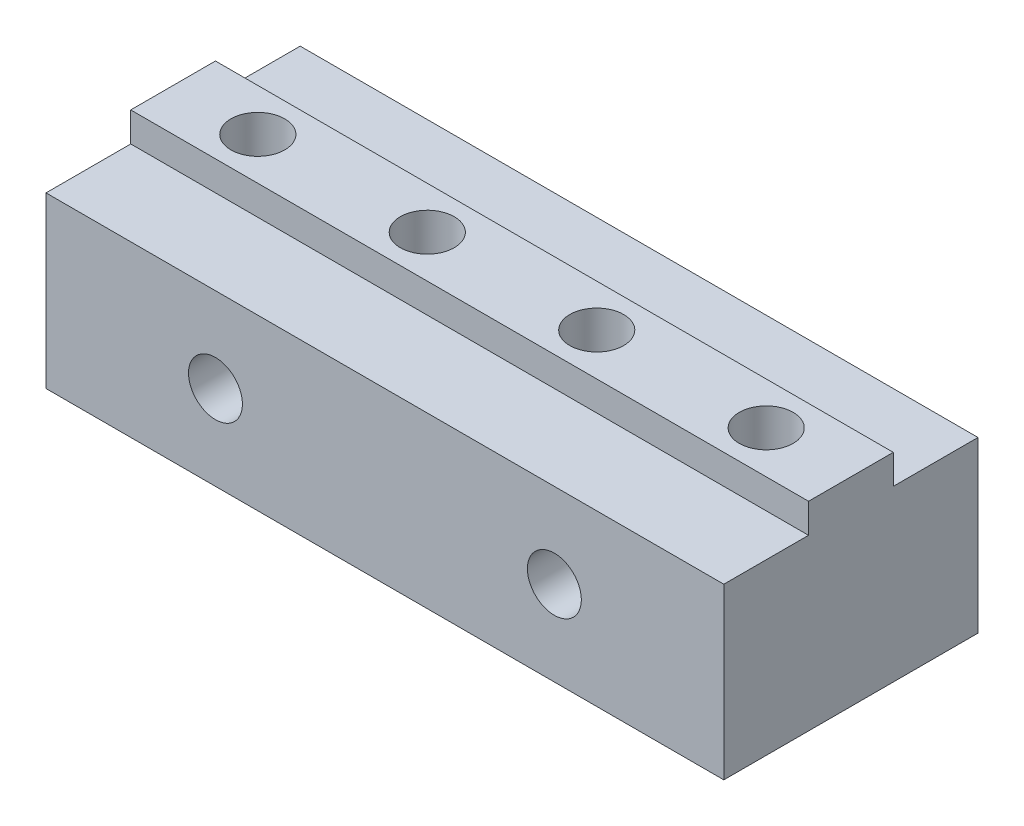
ISO-10303-21;
HEADER;
FILE_DESCRIPTION(('STEP AP214'),'2;1');
FILE_NAME('part.step','',(''),(''),'','','');
FILE_SCHEMA(('AUTOMOTIVE_DESIGN { 1 0 10303 214 1 1 1 1 }'));
ENDSEC;
DATA;
#1=APPLICATION_CONTEXT('core data for automotive mechanical design processes');
#2=APPLICATION_PROTOCOL_DEFINITION('international standard','automotive_design',2000,#1);
#3=PRODUCT_CONTEXT('',#1,'mechanical');
#4=PRODUCT('Part','Part','',(#3));
#5=PRODUCT_RELATED_PRODUCT_CATEGORY('part','',(#4));
#6=PRODUCT_DEFINITION_FORMATION('','',#4);
#7=PRODUCT_DEFINITION_CONTEXT('part definition',#1,'design');
#8=PRODUCT_DEFINITION('design','',#6,#7);
#9=PRODUCT_DEFINITION_SHAPE('','',#8);
#10=(LENGTH_UNIT() NAMED_UNIT(*) SI_UNIT(.MILLI.,.METRE.));
#11=(NAMED_UNIT(*) PLANE_ANGLE_UNIT() SI_UNIT($,.RADIAN.));
#12=(NAMED_UNIT(*) SI_UNIT($,.STERADIAN.) SOLID_ANGLE_UNIT());
#13=UNCERTAINTY_MEASURE_WITH_UNIT(LENGTH_MEASURE(1.E-05),#10,'distance_accuracy_value','');
#14=(GEOMETRIC_REPRESENTATION_CONTEXT(3) GLOBAL_UNCERTAINTY_ASSIGNED_CONTEXT((#13)) GLOBAL_UNIT_ASSIGNED_CONTEXT((#10,
#11,#12)) REPRESENTATION_CONTEXT('',''));
#15=CARTESIAN_POINT('',(0.,0.,0.));
#16=DIRECTION('',(0.,0.,1.));
#17=DIRECTION('',(1.,0.,0.));
#18=AXIS2_PLACEMENT_3D('',#15,#16,#17);
#19=CARTESIAN_POINT('',(0.,14.9098,0.));
#20=DIRECTION('',(0.,1.,0.));
#21=DIRECTION('',(0.,0.,1.));
#22=AXIS2_PLACEMENT_3D('',#19,#20,#21);
#23=PLANE('',#22);
#24=CARTESIAN_POINT('',(-19.05,14.9098,0.));
#25=DIRECTION('',(0.,-1.,0.));
#26=DIRECTION('',(0.,0.,-1.));
#27=AXIS2_PLACEMENT_3D('',#24,#25,#26);
#28=CIRCLE('',#27,2.0193);
#29=CARTESIAN_POINT('',(-19.05,14.9098,-2.0193));
#30=VERTEX_POINT('',#29);
#31=EDGE_CURVE('E246',#30,#30,#28,.T.);
#32=ORIENTED_EDGE('',*,*,#31,.T.);
#33=EDGE_LOOP('',(#32));
#34=FACE_BOUND('',#33,.T.);
#35=DIRECTION('',(0.,0.,1.));
#36=VECTOR('',#35,1.);
#37=CARTESIAN_POINT('',(-25.4,14.9098,3.175));
#38=LINE('',#37,#36);
#39=CARTESIAN_POINT('',(-25.4,14.9098,-3.175));
#40=VERTEX_POINT('',#39);
#41=CARTESIAN_POINT('',(-25.4,14.9098,3.175));
#42=VERTEX_POINT('',#41);
#43=EDGE_CURVE('E116',#40,#42,#38,.T.);
#44=ORIENTED_EDGE('',*,*,#43,.T.);
#45=DIRECTION('',(1.,0.,0.));
#46=VECTOR('',#45,1.);
#47=CARTESIAN_POINT('',(25.4,14.9098,3.175));
#48=LINE('',#47,#46);
#49=CARTESIAN_POINT('',(25.4,14.9098,3.175));
#50=VERTEX_POINT('',#49);
#51=EDGE_CURVE('E105',#42,#50,#48,.T.);
#52=ORIENTED_EDGE('',*,*,#51,.T.);
#53=DIRECTION('',(0.,0.,-1.));
#54=VECTOR('',#53,1.);
#55=CARTESIAN_POINT('',(25.4,14.9098,3.175));
#56=LINE('',#55,#54);
#57=CARTESIAN_POINT('',(25.4,14.9098,-3.175));
#58=VERTEX_POINT('',#57);
#59=EDGE_CURVE('E115',#50,#58,#56,.T.);
#60=ORIENTED_EDGE('',*,*,#59,.T.);
#61=DIRECTION('',(-1.,0.,0.));
#62=VECTOR('',#61,1.);
#63=CARTESIAN_POINT('',(25.4,14.9098,-3.175));
#64=LINE('',#63,#62);
#65=EDGE_CURVE('E121',#58,#40,#64,.T.);
#66=ORIENTED_EDGE('',*,*,#65,.T.);
#67=EDGE_LOOP('',(#44,#52,#60,#66));
#68=FACE_BOUND('',#67,.T.);
#69=CARTESIAN_POINT('',(19.05,14.9098,0.));
#70=DIRECTION('',(0.,-1.,0.));
#71=DIRECTION('',(0.,0.,-1.));
#72=AXIS2_PLACEMENT_3D('',#69,#70,#71);
#73=CIRCLE('',#72,2.0193);
#74=CARTESIAN_POINT('',(19.05,14.9098,-2.0193));
#75=VERTEX_POINT('',#74);
#76=EDGE_CURVE('E222',#75,#75,#73,.T.);
#77=ORIENTED_EDGE('',*,*,#76,.T.);
#78=EDGE_LOOP('',(#77));
#79=FACE_BOUND('',#78,.T.);
#80=CARTESIAN_POINT('',(6.35,14.9098,0.));
#81=DIRECTION('',(0.,-1.,0.));
#82=DIRECTION('',(0.,0.,-1.));
#83=AXIS2_PLACEMENT_3D('',#80,#81,#82);
#84=CIRCLE('',#83,2.0193);
#85=CARTESIAN_POINT('',(6.35,14.9098,-2.0193));
#86=VERTEX_POINT('',#85);
#87=EDGE_CURVE('E230',#86,#86,#84,.T.);
#88=ORIENTED_EDGE('',*,*,#87,.T.);
#89=EDGE_LOOP('',(#88));
#90=FACE_BOUND('',#89,.T.);
#91=CARTESIAN_POINT('',(-6.35,14.9098,0.));
#92=DIRECTION('',(0.,-1.,0.));
#93=DIRECTION('',(0.,0.,-1.));
#94=AXIS2_PLACEMENT_3D('',#91,#92,#93);
#95=CIRCLE('',#94,2.0193);
#96=CARTESIAN_POINT('',(-6.35,14.9098,-2.0193));
#97=VERTEX_POINT('',#96);
#98=EDGE_CURVE('E238',#97,#97,#95,.T.);
#99=ORIENTED_EDGE('',*,*,#98,.T.);
#100=EDGE_LOOP('',(#99));
#101=FACE_BOUND('',#100,.T.);
#102=ADVANCED_FACE('F39',(#34,#68,#79,#90,#101),#23,.T.);
#103=CARTESIAN_POINT('',(0.,12.7,0.));
#104=DIRECTION('',(0.,1.,0.));
#105=DIRECTION('',(0.,0.,1.));
#106=AXIS2_PLACEMENT_3D('',#103,#104,#105);
#107=PLANE('',#106);
#108=DIRECTION('',(-1.,0.,0.));
#109=VECTOR('',#108,1.);
#110=CARTESIAN_POINT('',(25.4,12.7,-3.175));
#111=LINE('',#110,#109);
#112=CARTESIAN_POINT('',(25.4,12.7,-3.175));
#113=VERTEX_POINT('',#112);
#114=CARTESIAN_POINT('',(-25.4,12.7,-3.175));
#115=VERTEX_POINT('',#114);
#116=EDGE_CURVE('E55',#113,#115,#111,.T.);
#117=ORIENTED_EDGE('',*,*,#116,.F.);
#118=DIRECTION('',(0.,0.,-1.));
#119=VECTOR('',#118,1.);
#120=CARTESIAN_POINT('',(25.4,12.7,9.525));
#121=LINE('',#120,#119);
#122=CARTESIAN_POINT('',(25.4,12.7,-9.525));
#123=VERTEX_POINT('',#122);
#124=EDGE_CURVE('E147',#113,#123,#121,.T.);
#125=ORIENTED_EDGE('',*,*,#124,.T.);
#126=DIRECTION('',(-1.,0.,0.));
#127=VECTOR('',#126,1.);
#128=CARTESIAN_POINT('',(25.4,12.7,-9.525));
#129=LINE('',#128,#127);
#130=CARTESIAN_POINT('',(-25.4,12.7,-9.52499999999999));
#131=VERTEX_POINT('',#130);
#132=EDGE_CURVE('E151',#123,#131,#129,.T.);
#133=ORIENTED_EDGE('',*,*,#132,.T.);
#134=DIRECTION('',(0.,0.,1.));
#135=VECTOR('',#134,1.);
#136=CARTESIAN_POINT('',(-25.4,12.7,9.525));
#137=LINE('',#136,#135);
#138=EDGE_CURVE('E141',#131,#115,#137,.T.);
#139=ORIENTED_EDGE('',*,*,#138,.T.);
#140=EDGE_LOOP('',(#117,#125,#133,#139));
#141=FACE_BOUND('',#140,.T.);
#142=ADVANCED_FACE('F189',(#141),#107,.T.);
#143=CARTESIAN_POINT('',(-25.4,12.7,9.525));
#144=DIRECTION('',(1.,0.,0.));
#145=DIRECTION('',(0.,0.,-1.));
#146=AXIS2_PLACEMENT_3D('',#143,#144,#145);
#147=PLANE('',#146);
#148=DIRECTION('',(0.,0.,1.));
#149=VECTOR('',#148,1.);
#150=CARTESIAN_POINT('',(-25.4,0.,9.525));
#151=LINE('',#150,#149);
#152=CARTESIAN_POINT('',(-25.4,0.,-9.52499999999999));
#153=VERTEX_POINT('',#152);
#154=CARTESIAN_POINT('',(-25.4,0.,9.525));
#155=VERTEX_POINT('',#154);
#156=EDGE_CURVE('E131',#153,#155,#151,.T.);
#157=ORIENTED_EDGE('',*,*,#156,.T.);
#158=DIRECTION('',(0.,-1.,0.));
#159=VECTOR('',#158,1.);
#160=CARTESIAN_POINT('',(-25.4,12.7,9.525));
#161=LINE('',#160,#159);
#162=CARTESIAN_POINT('',(-25.4,12.7,9.525));
#163=VERTEX_POINT('',#162);
#164=EDGE_CURVE('E11',#163,#155,#161,.T.);
#165=ORIENTED_EDGE('',*,*,#164,.F.);
#166=CARTESIAN_POINT('',(-25.4,12.7,3.175));
#167=VERTEX_POINT('',#166);
#168=EDGE_CURVE('E129',#167,#163,#137,.T.);
#169=ORIENTED_EDGE('',*,*,#168,.F.);
#170=DIRECTION('',(0.,-1.,0.));
#171=VECTOR('',#170,1.);
#172=CARTESIAN_POINT('',(-25.4,14.9098,3.175));
#173=LINE('',#172,#171);
#174=EDGE_CURVE('E109',#42,#167,#173,.T.);
#175=ORIENTED_EDGE('',*,*,#174,.F.);
#176=ORIENTED_EDGE('',*,*,#43,.F.);
#177=DIRECTION('',(0.,-1.,0.));
#178=VECTOR('',#177,1.);
#179=CARTESIAN_POINT('',(-25.4,14.9098,-3.175));
#180=LINE('',#179,#178);
#181=EDGE_CURVE('E188',#40,#115,#180,.T.);
#182=ORIENTED_EDGE('',*,*,#181,.T.);
#183=ORIENTED_EDGE('',*,*,#138,.F.);
#184=DIRECTION('',(0.,-1.,0.));
#185=VECTOR('',#184,1.);
#186=CARTESIAN_POINT('',(-25.4,12.7,-9.52499999999999));
#187=LINE('',#186,#185);
#188=EDGE_CURVE('E153',#131,#153,#187,.T.);
#189=ORIENTED_EDGE('',*,*,#188,.T.);
#190=EDGE_LOOP('',(#157,#165,#169,#175,#176,#182,#183,#189));
#191=FACE_BOUND('',#190,.T.);
#192=ADVANCED_FACE('F41',(#191),#147,.F.);
#193=CARTESIAN_POINT('',(25.4,12.7,9.525));
#194=DIRECTION('',(0.,0.,-1.));
#195=DIRECTION('',(-1.,0.,0.));
#196=AXIS2_PLACEMENT_3D('',#193,#194,#195);
#197=PLANE('',#196);
#198=CARTESIAN_POINT('',(12.7,6.35,9.52500000000001));
#199=DIRECTION('',(0.,0.,-1.));
#200=DIRECTION('',(-1.,0.,0.));
#201=AXIS2_PLACEMENT_3D('',#198,#199,#200);
#202=CIRCLE('',#201,2.0193);
#203=CARTESIAN_POINT('',(10.6807,6.35,9.52500000000001));
#204=VERTEX_POINT('',#203);
#205=EDGE_CURVE('E214',#204,#204,#202,.T.);
#206=ORIENTED_EDGE('',*,*,#205,.T.);
#207=EDGE_LOOP('',(#206));
#208=FACE_BOUND('',#207,.T.);
#209=CARTESIAN_POINT('',(-12.7,6.35,9.52500000000001));
#210=DIRECTION('',(0.,0.,-1.));
#211=DIRECTION('',(-1.,0.,0.));
#212=AXIS2_PLACEMENT_3D('',#209,#210,#211);
#213=CIRCLE('',#212,2.0193);
#214=CARTESIAN_POINT('',(-14.7193,6.35,9.52500000000001));
#215=VERTEX_POINT('',#214);
#216=EDGE_CURVE('E197',#215,#215,#213,.T.);
#217=ORIENTED_EDGE('',*,*,#216,.T.);
#218=EDGE_LOOP('',(#217));
#219=FACE_BOUND('',#218,.T.);
#220=DIRECTION('',(1.,0.,0.));
#221=VECTOR('',#220,1.);
#222=CARTESIAN_POINT('',(25.4,0.,9.525));
#223=LINE('',#222,#221);
#224=CARTESIAN_POINT('',(25.4,0.,9.525));
#225=VERTEX_POINT('',#224);
#226=EDGE_CURVE('E135',#155,#225,#223,.T.);
#227=ORIENTED_EDGE('',*,*,#226,.T.);
#228=DIRECTION('',(0.,-1.,0.));
#229=VECTOR('',#228,1.);
#230=CARTESIAN_POINT('',(25.4,12.7,9.525));
#231=LINE('',#230,#229);
#232=CARTESIAN_POINT('',(25.4,12.7,9.525));
#233=VERTEX_POINT('',#232);
#234=EDGE_CURVE('E48',#233,#225,#231,.T.);
#235=ORIENTED_EDGE('',*,*,#234,.F.);
#236=DIRECTION('',(1.,0.,0.));
#237=VECTOR('',#236,1.);
#238=CARTESIAN_POINT('',(25.4,12.7,9.525));
#239=LINE('',#238,#237);
#240=EDGE_CURVE('E144',#163,#233,#239,.T.);
#241=ORIENTED_EDGE('',*,*,#240,.F.);
#242=ORIENTED_EDGE('',*,*,#164,.T.);
#243=EDGE_LOOP('',(#227,#235,#241,#242));
#244=FACE_BOUND('',#243,.T.);
#245=ADVANCED_FACE('F302',(#208,#219,#244),#197,.F.);
#246=CARTESIAN_POINT('',(25.4,12.7,9.525));
#247=DIRECTION('',(-1.,0.,0.));
#248=DIRECTION('',(0.,0.,1.));
#249=AXIS2_PLACEMENT_3D('',#246,#247,#248);
#250=PLANE('',#249);
#251=DIRECTION('',(0.,0.,-1.));
#252=VECTOR('',#251,1.);
#253=CARTESIAN_POINT('',(25.4,0.,9.525));
#254=LINE('',#253,#252);
#255=CARTESIAN_POINT('',(25.4,0.,-9.525));
#256=VERTEX_POINT('',#255);
#257=EDGE_CURVE('E157',#225,#256,#254,.T.);
#258=ORIENTED_EDGE('',*,*,#257,.T.);
#259=DIRECTION('',(0.,-1.,0.));
#260=VECTOR('',#259,1.);
#261=CARTESIAN_POINT('',(25.4,12.7,-9.525));
#262=LINE('',#261,#260);
#263=EDGE_CURVE('E166',#123,#256,#262,.T.);
#264=ORIENTED_EDGE('',*,*,#263,.F.);
#265=ORIENTED_EDGE('',*,*,#124,.F.);
#266=DIRECTION('',(0.,-1.,0.));
#267=VECTOR('',#266,1.);
#268=CARTESIAN_POINT('',(25.4,14.9098,-3.175));
#269=LINE('',#268,#267);
#270=EDGE_CURVE('E137',#58,#113,#269,.T.);
#271=ORIENTED_EDGE('',*,*,#270,.F.);
#272=ORIENTED_EDGE('',*,*,#59,.F.);
#273=DIRECTION('',(0.,-1.,0.));
#274=VECTOR('',#273,1.);
#275=CARTESIAN_POINT('',(25.4,14.9098,3.175));
#276=LINE('',#275,#274);
#277=CARTESIAN_POINT('',(25.4,12.7,3.175));
#278=VERTEX_POINT('',#277);
#279=EDGE_CURVE('E111',#50,#278,#276,.T.);
#280=ORIENTED_EDGE('',*,*,#279,.T.);
#281=EDGE_CURVE('E148',#233,#278,#121,.T.);
#282=ORIENTED_EDGE('',*,*,#281,.F.);
#283=ORIENTED_EDGE('',*,*,#234,.T.);
#284=EDGE_LOOP('',(#258,#264,#265,#271,#272,#280,#282,#283));
#285=FACE_BOUND('',#284,.T.);
#286=ADVANCED_FACE('F175',(#285),#250,.F.);
#287=CARTESIAN_POINT('',(25.4,12.7,-9.525));
#288=DIRECTION('',(0.,0.,1.));
#289=DIRECTION('',(1.,0.,0.));
#290=AXIS2_PLACEMENT_3D('',#287,#288,#289);
#291=PLANE('',#290);
#292=CARTESIAN_POINT('',(12.7,6.35,-9.525));
#293=DIRECTION('',(0.,0.,-1.));
#294=DIRECTION('',(-1.,0.,0.));
#295=AXIS2_PLACEMENT_3D('',#292,#293,#294);
#296=CIRCLE('',#295,2.01929999999999);
#297=CARTESIAN_POINT('',(10.6807,6.35,-9.525));
#298=VERTEX_POINT('',#297);
#299=EDGE_CURVE('E218',#298,#298,#296,.T.);
#300=ORIENTED_EDGE('',*,*,#299,.F.);
#301=EDGE_LOOP('',(#300));
#302=FACE_BOUND('',#301,.T.);
#303=CARTESIAN_POINT('',(-12.7,6.35,-9.525));
#304=DIRECTION('',(0.,0.,-1.));
#305=DIRECTION('',(-1.,0.,0.));
#306=AXIS2_PLACEMENT_3D('',#303,#304,#305);
#307=CIRCLE('',#306,2.01929999999999);
#308=CARTESIAN_POINT('',(-14.7193,6.35,-9.525));
#309=VERTEX_POINT('',#308);
#310=EDGE_CURVE('E210',#309,#309,#307,.T.);
#311=ORIENTED_EDGE('',*,*,#310,.F.);
#312=EDGE_LOOP('',(#311));
#313=FACE_BOUND('',#312,.T.);
#314=DIRECTION('',(-1.,0.,0.));
#315=VECTOR('',#314,1.);
#316=CARTESIAN_POINT('',(25.4,0.,-9.525));
#317=LINE('',#316,#315);
#318=EDGE_CURVE('E160',#256,#153,#317,.T.);
#319=ORIENTED_EDGE('',*,*,#318,.T.);
#320=ORIENTED_EDGE('',*,*,#188,.F.);
#321=ORIENTED_EDGE('',*,*,#132,.F.);
#322=ORIENTED_EDGE('',*,*,#263,.T.);
#323=EDGE_LOOP('',(#319,#320,#321,#322));
#324=FACE_BOUND('',#323,.T.);
#325=ADVANCED_FACE('F185',(#302,#313,#324),#291,.F.);
#326=DIRECTION('',(1.,0.,0.));
#327=VECTOR('',#326,1.);
#328=CARTESIAN_POINT('',(25.4,12.7,3.175));
#329=LINE('',#328,#327);
#330=EDGE_CURVE('E63',#167,#278,#329,.T.);
#331=ORIENTED_EDGE('',*,*,#330,.F.);
#332=ORIENTED_EDGE('',*,*,#168,.T.);
#333=ORIENTED_EDGE('',*,*,#240,.T.);
#334=ORIENTED_EDGE('',*,*,#281,.T.);
#335=EDGE_LOOP('',(#331,#332,#333,#334));
#336=FACE_BOUND('',#335,.T.);
#337=ADVANCED_FACE('F259',(#336),#107,.T.);
#338=CARTESIAN_POINT('',(0.,0.,0.));
#339=DIRECTION('',(0.,1.,0.));
#340=DIRECTION('',(0.,0.,1.));
#341=AXIS2_PLACEMENT_3D('',#338,#339,#340);
#342=PLANE('',#341);
#343=CARTESIAN_POINT('',(-19.05,0.,0.));
#344=DIRECTION('',(0.,-1.,0.));
#345=DIRECTION('',(0.,0.,-1.));
#346=AXIS2_PLACEMENT_3D('',#343,#344,#345);
#347=CIRCLE('',#346,2.01929999999999);
#348=CARTESIAN_POINT('',(-19.05,0.,-2.01929999999999));
#349=VERTEX_POINT('',#348);
#350=EDGE_CURVE('E250',#349,#349,#347,.T.);
#351=ORIENTED_EDGE('',*,*,#350,.F.);
#352=EDGE_LOOP('',(#351));
#353=FACE_BOUND('',#352,.T.);
#354=CARTESIAN_POINT('',(-6.35,0.,0.));
#355=DIRECTION('',(0.,-1.,0.));
#356=DIRECTION('',(0.,0.,-1.));
#357=AXIS2_PLACEMENT_3D('',#354,#355,#356);
#358=CIRCLE('',#357,2.01929999999999);
#359=CARTESIAN_POINT('',(-6.35,0.,-2.01929999999999));
#360=VERTEX_POINT('',#359);
#361=EDGE_CURVE('E242',#360,#360,#358,.T.);
#362=ORIENTED_EDGE('',*,*,#361,.F.);
#363=EDGE_LOOP('',(#362));
#364=FACE_BOUND('',#363,.T.);
#365=CARTESIAN_POINT('',(6.35,0.,0.));
#366=DIRECTION('',(0.,-1.,0.));
#367=DIRECTION('',(0.,0.,-1.));
#368=AXIS2_PLACEMENT_3D('',#365,#366,#367);
#369=CIRCLE('',#368,2.01929999999999);
#370=CARTESIAN_POINT('',(6.35,0.,-2.01929999999999));
#371=VERTEX_POINT('',#370);
#372=EDGE_CURVE('E234',#371,#371,#369,.T.);
#373=ORIENTED_EDGE('',*,*,#372,.F.);
#374=EDGE_LOOP('',(#373));
#375=FACE_BOUND('',#374,.T.);
#376=CARTESIAN_POINT('',(19.05,0.,0.));
#377=DIRECTION('',(0.,-1.,0.));
#378=DIRECTION('',(0.,0.,-1.));
#379=AXIS2_PLACEMENT_3D('',#376,#377,#378);
#380=CIRCLE('',#379,2.01929999999999);
#381=CARTESIAN_POINT('',(19.05,0.,-2.01929999999999));
#382=VERTEX_POINT('',#381);
#383=EDGE_CURVE('E226',#382,#382,#380,.T.);
#384=ORIENTED_EDGE('',*,*,#383,.F.);
#385=EDGE_LOOP('',(#384));
#386=FACE_BOUND('',#385,.T.);
#387=ORIENTED_EDGE('',*,*,#156,.F.);
#388=ORIENTED_EDGE('',*,*,#318,.F.);
#389=ORIENTED_EDGE('',*,*,#257,.F.);
#390=ORIENTED_EDGE('',*,*,#226,.F.);
#391=EDGE_LOOP('',(#387,#388,#389,#390));
#392=FACE_BOUND('',#391,.T.);
#393=ADVANCED_FACE('F182',(#353,#364,#375,#386,#392),#342,.F.);
#394=CARTESIAN_POINT('',(25.4,14.9098,3.175));
#395=DIRECTION('',(0.,0.,-1.));
#396=DIRECTION('',(-1.,0.,0.));
#397=AXIS2_PLACEMENT_3D('',#394,#395,#396);
#398=PLANE('',#397);
#399=ORIENTED_EDGE('',*,*,#330,.T.);
#400=ORIENTED_EDGE('',*,*,#279,.F.);
#401=ORIENTED_EDGE('',*,*,#51,.F.);
#402=ORIENTED_EDGE('',*,*,#174,.T.);
#403=EDGE_LOOP('',(#399,#400,#401,#402));
#404=FACE_BOUND('',#403,.T.);
#405=ADVANCED_FACE('F107',(#404),#398,.F.);
#406=CARTESIAN_POINT('',(25.4,14.9098,-3.175));
#407=DIRECTION('',(0.,0.,1.));
#408=DIRECTION('',(1.,0.,0.));
#409=AXIS2_PLACEMENT_3D('',#406,#407,#408);
#410=PLANE('',#409);
#411=ORIENTED_EDGE('',*,*,#116,.T.);
#412=ORIENTED_EDGE('',*,*,#181,.F.);
#413=ORIENTED_EDGE('',*,*,#65,.F.);
#414=ORIENTED_EDGE('',*,*,#270,.T.);
#415=EDGE_LOOP('',(#411,#412,#413,#414));
#416=FACE_BOUND('',#415,.T.);
#417=ADVANCED_FACE('F192',(#416),#410,.F.);
#418=CARTESIAN_POINT('',(-12.7,6.35,-9.52499999999999));
#419=DIRECTION('',(0.,0.,-1.));
#420=DIRECTION('',(-1.,0.,0.));
#421=AXIS2_PLACEMENT_3D('',#418,#419,#420);
#422=CYLINDRICAL_SURFACE('',#421,2.01929999999999);
#423=ORIENTED_EDGE('',*,*,#216,.F.);
#424=EDGE_LOOP('',(#423));
#425=FACE_BOUND('',#424,.T.);
#426=ORIENTED_EDGE('',*,*,#310,.T.);
#427=EDGE_LOOP('',(#426));
#428=FACE_BOUND('',#427,.T.);
#429=ADVANCED_FACE('F280',(#425,#428),#422,.F.);
#430=CARTESIAN_POINT('',(12.7,6.35,-9.525));
#431=DIRECTION('',(0.,0.,-1.));
#432=DIRECTION('',(-1.,0.,0.));
#433=AXIS2_PLACEMENT_3D('',#430,#431,#432);
#434=CYLINDRICAL_SURFACE('',#433,2.01929999999999);
#435=ORIENTED_EDGE('',*,*,#205,.F.);
#436=EDGE_LOOP('',(#435));
#437=FACE_BOUND('',#436,.T.);
#438=ORIENTED_EDGE('',*,*,#299,.T.);
#439=EDGE_LOOP('',(#438));
#440=FACE_BOUND('',#439,.T.);
#441=ADVANCED_FACE('F270',(#437,#440),#434,.F.);
#442=CARTESIAN_POINT('',(19.05,0.,0.));
#443=DIRECTION('',(0.,-1.,0.));
#444=DIRECTION('',(0.,0.,-1.));
#445=AXIS2_PLACEMENT_3D('',#442,#443,#444);
#446=CYLINDRICAL_SURFACE('',#445,2.01929999999999);
#447=ORIENTED_EDGE('',*,*,#76,.F.);
#448=EDGE_LOOP('',(#447));
#449=FACE_BOUND('',#448,.T.);
#450=ORIENTED_EDGE('',*,*,#383,.T.);
#451=EDGE_LOOP('',(#450));
#452=FACE_BOUND('',#451,.T.);
#453=ADVANCED_FACE('F267',(#449,#452),#446,.F.);
#454=CARTESIAN_POINT('',(6.35,0.,0.));
#455=DIRECTION('',(0.,-1.,0.));
#456=DIRECTION('',(0.,0.,-1.));
#457=AXIS2_PLACEMENT_3D('',#454,#455,#456);
#458=CYLINDRICAL_SURFACE('',#457,2.01929999999999);
#459=ORIENTED_EDGE('',*,*,#87,.F.);
#460=EDGE_LOOP('',(#459));
#461=FACE_BOUND('',#460,.T.);
#462=ORIENTED_EDGE('',*,*,#372,.T.);
#463=EDGE_LOOP('',(#462));
#464=FACE_BOUND('',#463,.T.);
#465=ADVANCED_FACE('F269',(#461,#464),#458,.F.);
#466=CARTESIAN_POINT('',(-6.35,0.,0.));
#467=DIRECTION('',(0.,-1.,0.));
#468=DIRECTION('',(0.,0.,-1.));
#469=AXIS2_PLACEMENT_3D('',#466,#467,#468);
#470=CYLINDRICAL_SURFACE('',#469,2.01929999999999);
#471=ORIENTED_EDGE('',*,*,#98,.F.);
#472=EDGE_LOOP('',(#471));
#473=FACE_BOUND('',#472,.T.);
#474=ORIENTED_EDGE('',*,*,#361,.T.);
#475=EDGE_LOOP('',(#474));
#476=FACE_BOUND('',#475,.T.);
#477=ADVANCED_FACE('F277',(#473,#476),#470,.F.);
#478=CARTESIAN_POINT('',(-19.05,0.,0.));
#479=DIRECTION('',(0.,-1.,0.));
#480=DIRECTION('',(0.,0.,-1.));
#481=AXIS2_PLACEMENT_3D('',#478,#479,#480);
#482=CYLINDRICAL_SURFACE('',#481,2.01929999999999);
#483=ORIENTED_EDGE('',*,*,#31,.F.);
#484=EDGE_LOOP('',(#483));
#485=FACE_BOUND('',#484,.T.);
#486=ORIENTED_EDGE('',*,*,#350,.T.);
#487=EDGE_LOOP('',(#486));
#488=FACE_BOUND('',#487,.T.);
#489=ADVANCED_FACE('F255',(#485,#488),#482,.F.);
#490=CLOSED_SHELL('',(#102,#142,#192,#245,#286,#325,#337,#393,#405,#417,#429,#441,#453,#465,
#477,#489));
#491=MANIFOLD_SOLID_BREP('B2',#490);
#492=ADVANCED_BREP_SHAPE_REPRESENTATION('',(#18,#491),#14);
#493=SHAPE_DEFINITION_REPRESENTATION(#9,#492);
ENDSEC;
END-ISO-10303-21;
